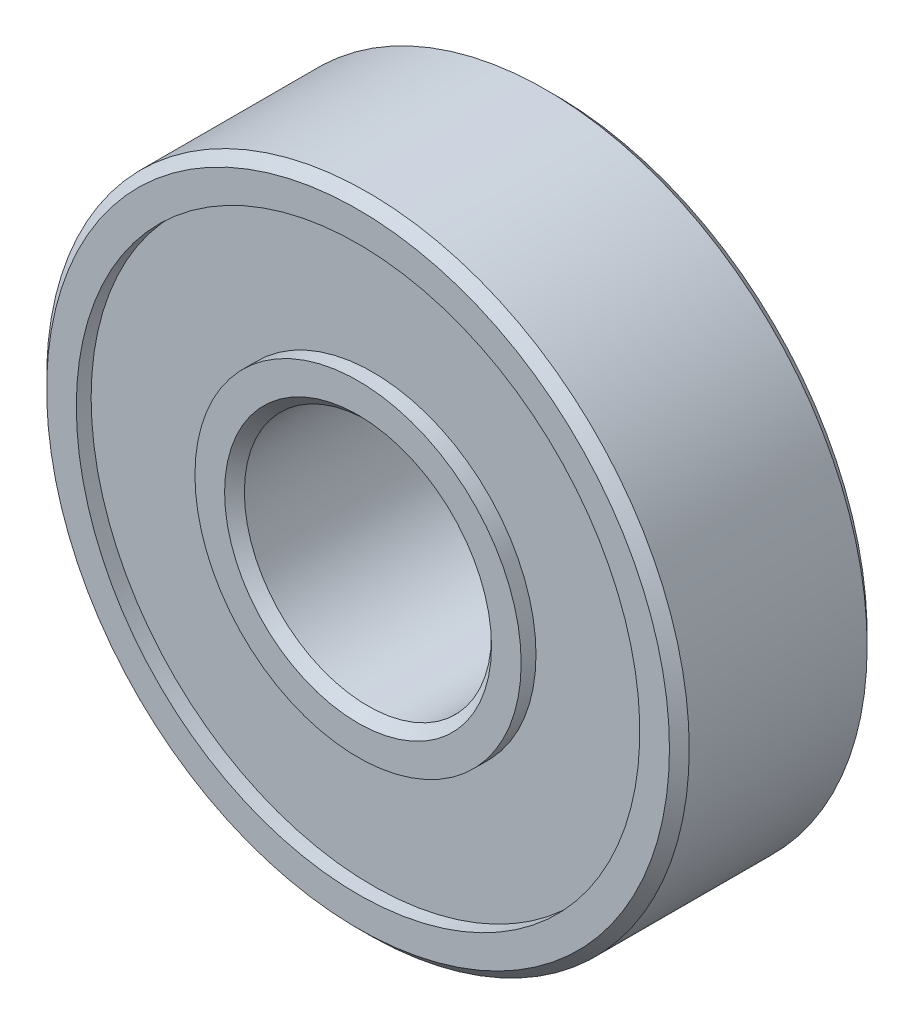
ISO-10303-21;
HEADER;
FILE_DESCRIPTION(('STEP AP214'),'2;1');
FILE_NAME('part.step','',(''),(''),'','','');
FILE_SCHEMA(('AUTOMOTIVE_DESIGN { 1 0 10303 214 1 1 1 1 }'));
ENDSEC;
DATA;
#1=APPLICATION_CONTEXT('core data for automotive mechanical design processes');
#2=APPLICATION_PROTOCOL_DEFINITION('international standard','automotive_design',2000,#1);
#3=PRODUCT_CONTEXT('',#1,'mechanical');
#4=PRODUCT('Part','Part','',(#3));
#5=PRODUCT_RELATED_PRODUCT_CATEGORY('part','',(#4));
#6=PRODUCT_DEFINITION_FORMATION('','',#4);
#7=PRODUCT_DEFINITION_CONTEXT('part definition',#1,'design');
#8=PRODUCT_DEFINITION('design','',#6,#7);
#9=PRODUCT_DEFINITION_SHAPE('','',#8);
#10=(LENGTH_UNIT() NAMED_UNIT(*) SI_UNIT(.MILLI.,.METRE.));
#11=(NAMED_UNIT(*) PLANE_ANGLE_UNIT() SI_UNIT($,.RADIAN.));
#12=(NAMED_UNIT(*) SI_UNIT($,.STERADIAN.) SOLID_ANGLE_UNIT());
#13=UNCERTAINTY_MEASURE_WITH_UNIT(LENGTH_MEASURE(1.E-05),#10,'distance_accuracy_value','');
#14=(GEOMETRIC_REPRESENTATION_CONTEXT(3) GLOBAL_UNCERTAINTY_ASSIGNED_CONTEXT((#13)) GLOBAL_UNIT_ASSIGNED_CONTEXT((#10,
#11,#12)) REPRESENTATION_CONTEXT('',''));
#15=CARTESIAN_POINT('',(0.,0.,0.));
#16=DIRECTION('',(0.,0.,1.));
#17=DIRECTION('',(1.,0.,0.));
#18=AXIS2_PLACEMENT_3D('',#15,#16,#17);
#19=CARTESIAN_POINT('',(0.,0.,1.7));
#20=DIRECTION('',(0.,0.,1.));
#21=DIRECTION('',(1.,0.,0.));
#22=AXIS2_PLACEMENT_3D('',#19,#20,#21);
#23=PLANE('',#22);
#24=CARTESIAN_POINT('',(0.,0.,1.7));
#25=DIRECTION('',(0.,0.,1.));
#26=DIRECTION('',(1.,0.,0.));
#27=AXIS2_PLACEMENT_3D('',#24,#25,#26);
#28=CIRCLE('',#27,3.3);
#29=CARTESIAN_POINT('',(-3.3,0.,1.7));
#30=VERTEX_POINT('',#29);
#31=EDGE_CURVE('E130',#30,#30,#28,.T.);
#32=ORIENTED_EDGE('',*,*,#31,.F.);
#33=EDGE_LOOP('',(#32));
#34=FACE_BOUND('',#33,.T.);
#35=CARTESIAN_POINT('',(0.,0.,1.7));
#36=DIRECTION('',(0.,0.,1.));
#37=DIRECTION('',(1.,0.,0.));
#38=AXIS2_PLACEMENT_3D('',#35,#36,#37);
#39=CIRCLE('',#38,5.7);
#40=CARTESIAN_POINT('',(-5.7,0.,1.7));
#41=VERTEX_POINT('',#40);
#42=EDGE_CURVE('E127',#41,#41,#39,.T.);
#43=ORIENTED_EDGE('',*,*,#42,.T.);
#44=EDGE_LOOP('',(#43));
#45=FACE_BOUND('',#44,.T.);
#46=ADVANCED_FACE('F17',(#34,#45),#23,.T.);
#47=CARTESIAN_POINT('',(0.,0.,-1.7));
#48=DIRECTION('',(0.,0.,-1.));
#49=DIRECTION('',(0.,-1.,0.));
#50=AXIS2_PLACEMENT_3D('',#47,#48,#49);
#51=PLANE('',#50);
#52=CARTESIAN_POINT('',(0.,0.,-1.7));
#53=DIRECTION('',(0.,0.,-1.));
#54=DIRECTION('',(-1.,0.,0.));
#55=AXIS2_PLACEMENT_3D('',#52,#53,#54);
#56=CIRCLE('',#55,3.3);
#57=CARTESIAN_POINT('',(3.3,0.,-1.7));
#58=VERTEX_POINT('',#57);
#59=EDGE_CURVE('E109',#58,#58,#56,.T.);
#60=ORIENTED_EDGE('',*,*,#59,.F.);
#61=EDGE_LOOP('',(#60));
#62=FACE_BOUND('',#61,.T.);
#63=CARTESIAN_POINT('',(0.,0.,-1.7));
#64=DIRECTION('',(0.,0.,-1.));
#65=DIRECTION('',(-1.,0.,0.));
#66=AXIS2_PLACEMENT_3D('',#63,#64,#65);
#67=CIRCLE('',#66,5.7);
#68=CARTESIAN_POINT('',(5.7,0.,-1.7));
#69=VERTEX_POINT('',#68);
#70=EDGE_CURVE('E174',#69,#69,#67,.T.);
#71=ORIENTED_EDGE('',*,*,#70,.T.);
#72=EDGE_LOOP('',(#71));
#73=FACE_BOUND('',#72,.T.);
#74=ADVANCED_FACE('F273',(#62,#73),#51,.T.);
#75=CARTESIAN_POINT('',(0.,0.,-2.));
#76=DIRECTION('',(0.,0.,1.));
#77=DIRECTION('',(1.,0.,0.));
#78=AXIS2_PLACEMENT_3D('',#75,#76,#77);
#79=PLANE('',#78);
#80=CARTESIAN_POINT('',(0.,0.,-2.));
#81=DIRECTION('',(0.,0.,-1.));
#82=DIRECTION('',(-1.,0.,0.));
#83=AXIS2_PLACEMENT_3D('',#80,#81,#82);
#84=CIRCLE('',#83,5.7);
#85=CARTESIAN_POINT('',(5.7,0.,-2.));
#86=VERTEX_POINT('',#85);
#87=EDGE_CURVE('E151',#86,#86,#84,.T.);
#88=ORIENTED_EDGE('',*,*,#87,.F.);
#89=EDGE_LOOP('',(#88));
#90=FACE_BOUND('',#89,.T.);
#91=CARTESIAN_POINT('',(0.,0.,-2.));
#92=DIRECTION('',(0.,0.,-1.));
#93=DIRECTION('',(1.,0.,0.));
#94=AXIS2_PLACEMENT_3D('',#91,#92,#93);
#95=CIRCLE('',#94,6.3);
#96=CARTESIAN_POINT('',(-6.3,0.,-2.));
#97=VERTEX_POINT('',#96);
#98=EDGE_CURVE('E139',#97,#97,#95,.T.);
#99=ORIENTED_EDGE('',*,*,#98,.T.);
#100=EDGE_LOOP('',(#99));
#101=FACE_BOUND('',#100,.T.);
#102=ADVANCED_FACE('F263',(#90,#101),#79,.F.);
#103=CARTESIAN_POINT('',(0.,0.,2.));
#104=DIRECTION('',(0.,0.,1.));
#105=DIRECTION('',(1.,0.,0.));
#106=AXIS2_PLACEMENT_3D('',#103,#104,#105);
#107=PLANE('',#106);
#108=CARTESIAN_POINT('',(0.,0.,2.));
#109=DIRECTION('',(0.,0.,1.));
#110=DIRECTION('',(1.,0.,0.));
#111=AXIS2_PLACEMENT_3D('',#108,#109,#110);
#112=CIRCLE('',#111,5.7);
#113=CARTESIAN_POINT('',(-5.7,0.,2.));
#114=VERTEX_POINT('',#113);
#115=EDGE_CURVE('E115',#114,#114,#112,.T.);
#116=ORIENTED_EDGE('',*,*,#115,.F.);
#117=EDGE_LOOP('',(#116));
#118=FACE_BOUND('',#117,.T.);
#119=CARTESIAN_POINT('',(0.,0.,2.));
#120=DIRECTION('',(0.,0.,1.));
#121=DIRECTION('',(1.,0.,0.));
#122=AXIS2_PLACEMENT_3D('',#119,#120,#121);
#123=CIRCLE('',#122,6.3);
#124=CARTESIAN_POINT('',(6.3,0.,2.));
#125=VERTEX_POINT('',#124);
#126=EDGE_CURVE('E21',#125,#125,#123,.T.);
#127=ORIENTED_EDGE('',*,*,#126,.T.);
#128=EDGE_LOOP('',(#127));
#129=FACE_BOUND('',#128,.T.);
#130=ADVANCED_FACE('F254',(#118,#129),#107,.T.);
#131=CARTESIAN_POINT('',(0.,0.,-2.));
#132=DIRECTION('',(0.,0.,1.));
#133=DIRECTION('',(1.,0.,0.));
#134=AXIS2_PLACEMENT_3D('',#131,#132,#133);
#135=PLANE('',#134);
#136=CARTESIAN_POINT('',(0.,0.,-2.));
#137=DIRECTION('',(0.,0.,1.));
#138=DIRECTION('',(1.,0.,0.));
#139=AXIS2_PLACEMENT_3D('',#136,#137,#138);
#140=CIRCLE('',#139,2.7);
#141=CARTESIAN_POINT('',(2.7,0.,-2.));
#142=VERTEX_POINT('',#141);
#143=EDGE_CURVE('E40',#142,#142,#140,.T.);
#144=ORIENTED_EDGE('',*,*,#143,.T.);
#145=EDGE_LOOP('',(#144));
#146=FACE_BOUND('',#145,.T.);
#147=CARTESIAN_POINT('',(0.,0.,-2.));
#148=DIRECTION('',(0.,0.,-1.));
#149=DIRECTION('',(-1.,0.,0.));
#150=AXIS2_PLACEMENT_3D('',#147,#148,#149);
#151=CIRCLE('',#150,3.3);
#152=CARTESIAN_POINT('',(3.3,0.,-2.));
#153=VERTEX_POINT('',#152);
#154=EDGE_CURVE('E107',#153,#153,#151,.T.);
#155=ORIENTED_EDGE('',*,*,#154,.T.);
#156=EDGE_LOOP('',(#155));
#157=FACE_BOUND('',#156,.T.);
#158=ADVANCED_FACE('F113',(#146,#157),#135,.F.);
#159=CARTESIAN_POINT('',(0.,0.,2.));
#160=DIRECTION('',(0.,0.,1.));
#161=DIRECTION('',(1.,0.,0.));
#162=AXIS2_PLACEMENT_3D('',#159,#160,#161);
#163=PLANE('',#162);
#164=CARTESIAN_POINT('',(0.,0.,2.));
#165=DIRECTION('',(0.,0.,-1.));
#166=DIRECTION('',(1.,0.,0.));
#167=AXIS2_PLACEMENT_3D('',#164,#165,#166);
#168=CIRCLE('',#167,2.7);
#169=CARTESIAN_POINT('',(-2.7,0.,2.));
#170=VERTEX_POINT('',#169);
#171=EDGE_CURVE('E125',#170,#170,#168,.T.);
#172=ORIENTED_EDGE('',*,*,#171,.T.);
#173=EDGE_LOOP('',(#172));
#174=FACE_BOUND('',#173,.T.);
#175=CARTESIAN_POINT('',(0.,0.,2.));
#176=DIRECTION('',(0.,0.,1.));
#177=DIRECTION('',(1.,0.,0.));
#178=AXIS2_PLACEMENT_3D('',#175,#176,#177);
#179=CIRCLE('',#178,3.3);
#180=CARTESIAN_POINT('',(-3.3,0.,2.));
#181=VERTEX_POINT('',#180);
#182=EDGE_CURVE('E158',#181,#181,#179,.T.);
#183=ORIENTED_EDGE('',*,*,#182,.T.);
#184=EDGE_LOOP('',(#183));
#185=FACE_BOUND('',#184,.T.);
#186=ADVANCED_FACE('F216',(#174,#185),#163,.T.);
#187=CARTESIAN_POINT('',(0.,0.,2.));
#188=DIRECTION('',(0.,0.,-1.));
#189=DIRECTION('',(-1.,0.,0.));
#190=AXIS2_PLACEMENT_3D('',#187,#188,#189);
#191=CYLINDRICAL_SURFACE('',#190,6.5);
#192=CARTESIAN_POINT('',(0.,0.,-1.8));
#193=DIRECTION('',(0.,0.,1.));
#194=DIRECTION('',(1.,0.,0.));
#195=AXIS2_PLACEMENT_3D('',#192,#193,#194);
#196=CIRCLE('',#195,6.5);
#197=CARTESIAN_POINT('',(6.5,0.,-1.8));
#198=VERTEX_POINT('',#197);
#199=CARTESIAN_POINT('',(-6.5,0.,-1.8));
#200=VERTEX_POINT('',#199);
#201=EDGE_CURVE('E136',#198,#200,#196,.T.);
#202=ORIENTED_EDGE('',*,*,#201,.T.);
#203=CARTESIAN_POINT('',(0.,0.,-1.8));
#204=DIRECTION('',(0.,0.,1.));
#205=DIRECTION('',(1.,0.,0.));
#206=AXIS2_PLACEMENT_3D('',#203,#204,#205);
#207=CIRCLE('',#206,6.5);
#208=EDGE_CURVE('E131',#200,#198,#207,.T.);
#209=ORIENTED_EDGE('',*,*,#208,.T.);
#210=DIRECTION('',(0.,0.,1.));
#211=VECTOR('',#210,1.);
#212=CARTESIAN_POINT('',(6.5,0.,2.));
#213=LINE('',#212,#211);
#214=CARTESIAN_POINT('',(6.5,0.,1.8));
#215=VERTEX_POINT('',#214);
#216=EDGE_CURVE('E11',#198,#215,#213,.T.);
#217=ORIENTED_EDGE('',*,*,#216,.T.);
#218=CARTESIAN_POINT('',(0.,0.,1.8));
#219=DIRECTION('',(0.,0.,-1.));
#220=DIRECTION('',(1.,0.,0.));
#221=AXIS2_PLACEMENT_3D('',#218,#219,#220);
#222=CIRCLE('',#221,6.5);
#223=EDGE_CURVE('E146',#215,#215,#222,.T.);
#224=ORIENTED_EDGE('',*,*,#223,.T.);
#225=ORIENTED_EDGE('',*,*,#216,.F.);
#226=EDGE_LOOP('',(#202,#209,#217,#224,#225));
#227=FACE_BOUND('',#226,.T.);
#228=ADVANCED_FACE('F221',(#227),#191,.T.);
#229=CARTESIAN_POINT('',(0.,0.,2.));
#230=DIRECTION('',(0.,0.,-1.));
#231=DIRECTION('',(-1.,0.,0.));
#232=AXIS2_PLACEMENT_3D('',#229,#230,#231);
#233=CYLINDRICAL_SURFACE('',#232,2.5);
#234=CARTESIAN_POINT('',(0.,0.,1.8));
#235=DIRECTION('',(0.,0.,1.));
#236=DIRECTION('',(1.,0.,0.));
#237=AXIS2_PLACEMENT_3D('',#234,#235,#236);
#238=CIRCLE('',#237,2.5);
#239=CARTESIAN_POINT('',(2.5,0.,1.8));
#240=VERTEX_POINT('',#239);
#241=CARTESIAN_POINT('',(-2.5,0.,1.8));
#242=VERTEX_POINT('',#241);
#243=EDGE_CURVE('E141',#240,#242,#238,.T.);
#244=ORIENTED_EDGE('',*,*,#243,.T.);
#245=CARTESIAN_POINT('',(0.,0.,1.8));
#246=DIRECTION('',(0.,0.,1.));
#247=DIRECTION('',(1.,0.,0.));
#248=AXIS2_PLACEMENT_3D('',#245,#246,#247);
#249=CIRCLE('',#248,2.5);
#250=EDGE_CURVE('E145',#242,#240,#249,.T.);
#251=ORIENTED_EDGE('',*,*,#250,.T.);
#252=DIRECTION('',(0.,0.,-1.));
#253=VECTOR('',#252,1.);
#254=CARTESIAN_POINT('',(2.5,0.,2.));
#255=LINE('',#254,#253);
#256=CARTESIAN_POINT('',(2.5,0.,-1.8));
#257=VERTEX_POINT('',#256);
#258=EDGE_CURVE('E28',#240,#257,#255,.T.);
#259=ORIENTED_EDGE('',*,*,#258,.T.);
#260=CARTESIAN_POINT('',(0.,0.,-1.8));
#261=DIRECTION('',(0.,0.,-1.));
#262=DIRECTION('',(1.,0.,0.));
#263=AXIS2_PLACEMENT_3D('',#260,#261,#262);
#264=CIRCLE('',#263,2.5);
#265=EDGE_CURVE('E162',#257,#257,#264,.T.);
#266=ORIENTED_EDGE('',*,*,#265,.T.);
#267=ORIENTED_EDGE('',*,*,#258,.F.);
#268=EDGE_LOOP('',(#244,#251,#259,#266,#267));
#269=FACE_BOUND('',#268,.T.);
#270=ADVANCED_FACE('F232',(#269),#233,.F.);
#271=CARTESIAN_POINT('',(0.,0.,-2.));
#272=DIRECTION('',(0.,0.,-1.));
#273=DIRECTION('',(-1.,0.,0.));
#274=AXIS2_PLACEMENT_3D('',#271,#272,#273);
#275=CONICAL_SURFACE('',#274,2.7,0.785398163397448);
#276=ORIENTED_EDGE('',*,*,#265,.F.);
#277=DIRECTION('',(0.707106781186547,0.,-0.707106781186548));
#278=VECTOR('',#277,1.);
#279=CARTESIAN_POINT('',(2.7,0.,-2.));
#280=LINE('',#279,#278);
#281=EDGE_CURVE('E166',#257,#142,#280,.T.);
#282=ORIENTED_EDGE('',*,*,#281,.T.);
#283=ORIENTED_EDGE('',*,*,#143,.F.);
#284=ORIENTED_EDGE('',*,*,#281,.F.);
#285=EDGE_LOOP('',(#276,#282,#283,#284));
#286=FACE_BOUND('',#285,.T.);
#287=ADVANCED_FACE('F239',(#286),#275,.F.);
#288=CARTESIAN_POINT('',(0.,0.,-1.8));
#289=DIRECTION('',(0.,0.,1.));
#290=DIRECTION('',(1.,0.,0.));
#291=AXIS2_PLACEMENT_3D('',#288,#289,#290);
#292=CONICAL_SURFACE('',#291,6.5,0.785398163397455);
#293=ORIENTED_EDGE('',*,*,#201,.F.);
#294=ORIENTED_EDGE('',*,*,#208,.F.);
#295=DIRECTION('',(0.707106781186552,0.,-0.707106781186543));
#296=VECTOR('',#295,1.);
#297=CARTESIAN_POINT('',(-6.5,0.,-1.8));
#298=LINE('',#297,#296);
#299=EDGE_CURVE('E135',#200,#97,#298,.T.);
#300=ORIENTED_EDGE('',*,*,#299,.T.);
#301=ORIENTED_EDGE('',*,*,#98,.F.);
#302=ORIENTED_EDGE('',*,*,#299,.F.);
#303=EDGE_LOOP('',(#293,#294,#300,#301,#302));
#304=FACE_BOUND('',#303,.T.);
#305=ADVANCED_FACE('F244',(#304),#292,.T.);
#306=CARTESIAN_POINT('',(0.,0.,1.8));
#307=DIRECTION('',(0.,0.,1.));
#308=DIRECTION('',(1.,0.,0.));
#309=AXIS2_PLACEMENT_3D('',#306,#307,#308);
#310=CONICAL_SURFACE('',#309,2.5,0.785398163397457);
#311=ORIENTED_EDGE('',*,*,#243,.F.);
#312=ORIENTED_EDGE('',*,*,#250,.F.);
#313=DIRECTION('',(-0.707106781186554,0.,0.707106781186541));
#314=VECTOR('',#313,1.);
#315=CARTESIAN_POINT('',(-2.5,0.,1.8));
#316=LINE('',#315,#314);
#317=EDGE_CURVE('E178',#242,#170,#316,.T.);
#318=ORIENTED_EDGE('',*,*,#317,.T.);
#319=ORIENTED_EDGE('',*,*,#171,.F.);
#320=ORIENTED_EDGE('',*,*,#317,.F.);
#321=EDGE_LOOP('',(#311,#312,#318,#319,#320));
#322=FACE_BOUND('',#321,.T.);
#323=ADVANCED_FACE('F290',(#322),#310,.F.);
#324=CARTESIAN_POINT('',(0.,0.,2.));
#325=DIRECTION('',(0.,0.,-1.));
#326=DIRECTION('',(-1.,0.,0.));
#327=AXIS2_PLACEMENT_3D('',#324,#325,#326);
#328=CONICAL_SURFACE('',#327,6.3,0.785398163397439);
#329=ORIENTED_EDGE('',*,*,#223,.F.);
#330=DIRECTION('',(-0.707106781186541,0.,0.707106781186554));
#331=VECTOR('',#330,1.);
#332=CARTESIAN_POINT('',(6.3,0.,2.));
#333=LINE('',#332,#331);
#334=EDGE_CURVE('E150',#215,#125,#333,.T.);
#335=ORIENTED_EDGE('',*,*,#334,.T.);
#336=ORIENTED_EDGE('',*,*,#126,.F.);
#337=ORIENTED_EDGE('',*,*,#334,.F.);
#338=EDGE_LOOP('',(#329,#335,#336,#337));
#339=FACE_BOUND('',#338,.T.);
#340=ADVANCED_FACE('F283',(#339),#328,.T.);
#341=CARTESIAN_POINT('',(0.,0.,-1.7));
#342=DIRECTION('',(0.,0.,-1.));
#343=DIRECTION('',(-1.,0.,0.));
#344=AXIS2_PLACEMENT_3D('',#341,#342,#343);
#345=CYLINDRICAL_SURFACE('',#344,5.7);
#346=ORIENTED_EDGE('',*,*,#70,.F.);
#347=DIRECTION('',(0.,0.,-1.));
#348=VECTOR('',#347,1.);
#349=CARTESIAN_POINT('',(5.7,0.,-1.7));
#350=LINE('',#349,#348);
#351=EDGE_CURVE('E192',#69,#86,#350,.T.);
#352=ORIENTED_EDGE('',*,*,#351,.T.);
#353=ORIENTED_EDGE('',*,*,#87,.T.);
#354=ORIENTED_EDGE('',*,*,#351,.F.);
#355=EDGE_LOOP('',(#346,#352,#353,#354));
#356=FACE_BOUND('',#355,.T.);
#357=ADVANCED_FACE('F208',(#356),#345,.F.);
#358=CARTESIAN_POINT('',(0.,0.,-1.7));
#359=DIRECTION('',(0.,0.,-1.));
#360=DIRECTION('',(-1.,0.,0.));
#361=AXIS2_PLACEMENT_3D('',#358,#359,#360);
#362=CYLINDRICAL_SURFACE('',#361,3.3);
#363=ORIENTED_EDGE('',*,*,#154,.F.);
#364=DIRECTION('',(0.,0.,1.));
#365=VECTOR('',#364,1.);
#366=CARTESIAN_POINT('',(3.3,0.,-1.7));
#367=LINE('',#366,#365);
#368=EDGE_CURVE('E104',#153,#58,#367,.T.);
#369=ORIENTED_EDGE('',*,*,#368,.T.);
#370=ORIENTED_EDGE('',*,*,#59,.T.);
#371=ORIENTED_EDGE('',*,*,#368,.F.);
#372=EDGE_LOOP('',(#363,#369,#370,#371));
#373=FACE_BOUND('',#372,.T.);
#374=ADVANCED_FACE('F106',(#373),#362,.T.);
#375=CARTESIAN_POINT('',(0.,0.,1.7));
#376=DIRECTION('',(0.,0.,1.));
#377=DIRECTION('',(1.,0.,0.));
#378=AXIS2_PLACEMENT_3D('',#375,#376,#377);
#379=CYLINDRICAL_SURFACE('',#378,5.7);
#380=ORIENTED_EDGE('',*,*,#42,.F.);
#381=DIRECTION('',(0.,0.,1.));
#382=VECTOR('',#381,1.);
#383=CARTESIAN_POINT('',(-5.7,0.,1.7));
#384=LINE('',#383,#382);
#385=EDGE_CURVE('E121',#41,#114,#384,.T.);
#386=ORIENTED_EDGE('',*,*,#385,.T.);
#387=ORIENTED_EDGE('',*,*,#115,.T.);
#388=ORIENTED_EDGE('',*,*,#385,.F.);
#389=EDGE_LOOP('',(#380,#386,#387,#388));
#390=FACE_BOUND('',#389,.T.);
#391=ADVANCED_FACE('F207',(#390),#379,.F.);
#392=CARTESIAN_POINT('',(0.,0.,1.7));
#393=DIRECTION('',(0.,0.,1.));
#394=DIRECTION('',(1.,0.,0.));
#395=AXIS2_PLACEMENT_3D('',#392,#393,#394);
#396=CYLINDRICAL_SURFACE('',#395,3.3);
#397=ORIENTED_EDGE('',*,*,#182,.F.);
#398=DIRECTION('',(0.,0.,-1.));
#399=VECTOR('',#398,1.);
#400=CARTESIAN_POINT('',(-3.3,0.,1.7));
#401=LINE('',#400,#399);
#402=EDGE_CURVE('E153',#181,#30,#401,.T.);
#403=ORIENTED_EDGE('',*,*,#402,.T.);
#404=ORIENTED_EDGE('',*,*,#31,.T.);
#405=ORIENTED_EDGE('',*,*,#402,.F.);
#406=EDGE_LOOP('',(#397,#403,#404,#405));
#407=FACE_BOUND('',#406,.T.);
#408=ADVANCED_FACE('F19',(#407),#396,.T.);
#409=CLOSED_SHELL('',(#46,#74,#102,#130,#158,#186,#228,#270,#287,#305,#323,#340,#357,#374,#391,#408));
#410=MANIFOLD_SOLID_BREP('B1',#409);
#411=ADVANCED_BREP_SHAPE_REPRESENTATION('',(#18,#410),#14);
#412=SHAPE_DEFINITION_REPRESENTATION(#9,#411);
ENDSEC;
END-ISO-10303-21;
